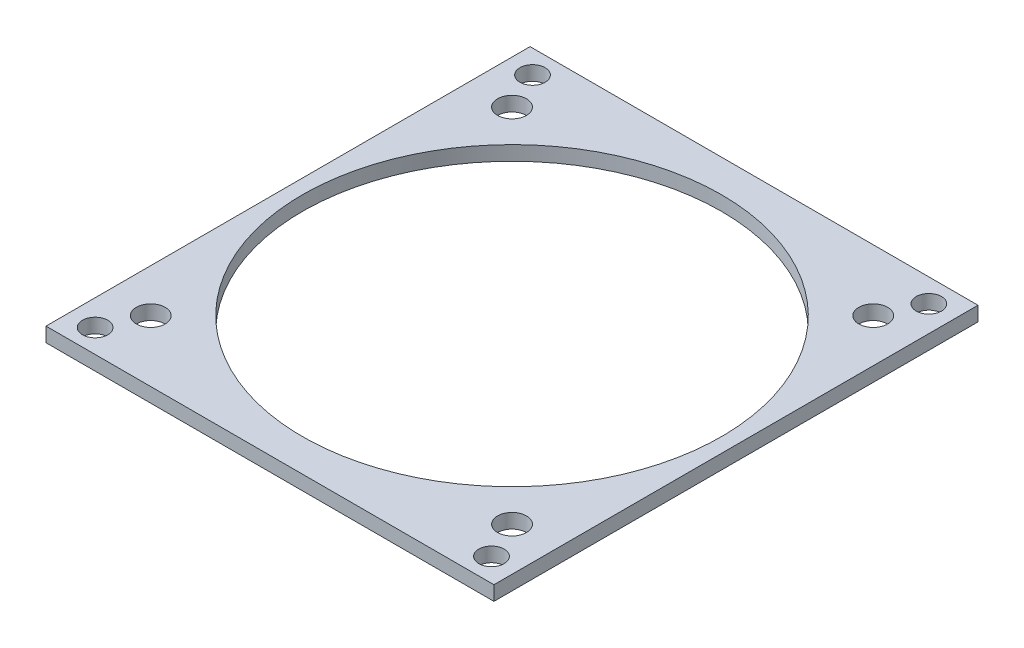
ISO-10303-21;
HEADER;
FILE_DESCRIPTION(('STEP AP214'),'2;1');
FILE_NAME('part.step','',(''),(''),'','','');
FILE_SCHEMA(('AUTOMOTIVE_DESIGN { 1 0 10303 214 1 1 1 1 }'));
ENDSEC;
DATA;
#1=APPLICATION_CONTEXT('core data for automotive mechanical design processes');
#2=APPLICATION_PROTOCOL_DEFINITION('international standard','automotive_design',2000,#1);
#3=PRODUCT_CONTEXT('',#1,'mechanical');
#4=PRODUCT('Part','Part','',(#3));
#5=PRODUCT_RELATED_PRODUCT_CATEGORY('part','',(#4));
#6=PRODUCT_DEFINITION_FORMATION('','',#4);
#7=PRODUCT_DEFINITION_CONTEXT('part definition',#1,'design');
#8=PRODUCT_DEFINITION('design','',#6,#7);
#9=PRODUCT_DEFINITION_SHAPE('','',#8);
#10=(LENGTH_UNIT() NAMED_UNIT(*) SI_UNIT(.MILLI.,.METRE.));
#11=(NAMED_UNIT(*) PLANE_ANGLE_UNIT() SI_UNIT($,.RADIAN.));
#12=(NAMED_UNIT(*) SI_UNIT($,.STERADIAN.) SOLID_ANGLE_UNIT());
#13=UNCERTAINTY_MEASURE_WITH_UNIT(LENGTH_MEASURE(1.E-05),#10,'distance_accuracy_value','');
#14=(GEOMETRIC_REPRESENTATION_CONTEXT(3) GLOBAL_UNCERTAINTY_ASSIGNED_CONTEXT((#13)) GLOBAL_UNIT_ASSIGNED_CONTEXT((#10,
#11,#12)) REPRESENTATION_CONTEXT('',''));
#15=CARTESIAN_POINT('',(0.,0.,0.));
#16=DIRECTION('',(0.,0.,1.));
#17=DIRECTION('',(1.,0.,0.));
#18=AXIS2_PLACEMENT_3D('',#15,#16,#17);
#19=CARTESIAN_POINT('',(31.,2.,0.));
#20=DIRECTION('',(1.,0.,0.));
#21=DIRECTION('',(0.,0.,-1.));
#22=AXIS2_PLACEMENT_3D('',#19,#20,#21);
#23=PLANE('',#22);
#24=DIRECTION('',(0.,0.,1.));
#25=VECTOR('',#24,1.);
#26=CARTESIAN_POINT('',(31.,0.,0.));
#27=LINE('',#26,#25);
#28=CARTESIAN_POINT('',(31.,0.,-33.5));
#29=VERTEX_POINT('',#28);
#30=CARTESIAN_POINT('',(31.,0.,33.5));
#31=VERTEX_POINT('',#30);
#32=EDGE_CURVE('E129',#29,#31,#27,.T.);
#33=ORIENTED_EDGE('',*,*,#32,.F.);
#34=DIRECTION('',(0.,-1.,0.));
#35=VECTOR('',#34,1.);
#36=CARTESIAN_POINT('',(31.,2.,-33.5));
#37=LINE('',#36,#35);
#38=CARTESIAN_POINT('',(31.,2.,-33.5));
#39=VERTEX_POINT('',#38);
#40=EDGE_CURVE('E11',#39,#29,#37,.T.);
#41=ORIENTED_EDGE('',*,*,#40,.F.);
#42=DIRECTION('',(0.,0.,1.));
#43=VECTOR('',#42,1.);
#44=CARTESIAN_POINT('',(31.,2.,0.));
#45=LINE('',#44,#43);
#46=CARTESIAN_POINT('',(31.,2.,33.5));
#47=VERTEX_POINT('',#46);
#48=EDGE_CURVE('E102',#39,#47,#45,.T.);
#49=ORIENTED_EDGE('',*,*,#48,.T.);
#50=DIRECTION('',(0.,-1.,0.));
#51=VECTOR('',#50,1.);
#52=CARTESIAN_POINT('',(31.,2.,33.5));
#53=LINE('',#52,#51);
#54=EDGE_CURVE('E79',#47,#31,#53,.T.);
#55=ORIENTED_EDGE('',*,*,#54,.T.);
#56=EDGE_LOOP('',(#33,#41,#49,#55));
#57=FACE_BOUND('',#56,.T.);
#58=ADVANCED_FACE('F38',(#57),#23,.T.);
#59=CARTESIAN_POINT('',(0.,2.,-33.5));
#60=DIRECTION('',(0.,0.,-1.));
#61=DIRECTION('',(-1.,0.,0.));
#62=AXIS2_PLACEMENT_3D('',#59,#60,#61);
#63=PLANE('',#62);
#64=DIRECTION('',(1.,0.,0.));
#65=VECTOR('',#64,1.);
#66=CARTESIAN_POINT('',(0.,0.,-33.5));
#67=LINE('',#66,#65);
#68=CARTESIAN_POINT('',(-31.,0.,-33.5));
#69=VERTEX_POINT('',#68);
#70=EDGE_CURVE('E91',#69,#29,#67,.T.);
#71=ORIENTED_EDGE('',*,*,#70,.F.);
#72=DIRECTION('',(0.,-1.,0.));
#73=VECTOR('',#72,1.);
#74=CARTESIAN_POINT('',(-31.,2.,-33.5));
#75=LINE('',#74,#73);
#76=CARTESIAN_POINT('',(-31.,2.,-33.5));
#77=VERTEX_POINT('',#76);
#78=EDGE_CURVE('E48',#77,#69,#75,.T.);
#79=ORIENTED_EDGE('',*,*,#78,.F.);
#80=DIRECTION('',(1.,0.,0.));
#81=VECTOR('',#80,1.);
#82=CARTESIAN_POINT('',(0.,2.,-33.5));
#83=LINE('',#82,#81);
#84=EDGE_CURVE('E89',#77,#39,#83,.T.);
#85=ORIENTED_EDGE('',*,*,#84,.T.);
#86=ORIENTED_EDGE('',*,*,#40,.T.);
#87=EDGE_LOOP('',(#71,#79,#85,#86));
#88=FACE_BOUND('',#87,.T.);
#89=ADVANCED_FACE('F87',(#88),#63,.T.);
#90=CARTESIAN_POINT('',(-31.,2.,0.));
#91=DIRECTION('',(1.,0.,0.));
#92=DIRECTION('',(0.,0.,-1.));
#93=AXIS2_PLACEMENT_3D('',#90,#91,#92);
#94=PLANE('',#93);
#95=DIRECTION('',(0.,0.,1.));
#96=VECTOR('',#95,1.);
#97=CARTESIAN_POINT('',(-31.,0.,0.));
#98=LINE('',#97,#96);
#99=CARTESIAN_POINT('',(-31.,0.,33.5));
#100=VERTEX_POINT('',#99);
#101=EDGE_CURVE('E134',#69,#100,#98,.T.);
#102=ORIENTED_EDGE('',*,*,#101,.T.);
#103=DIRECTION('',(0.,-1.,0.));
#104=VECTOR('',#103,1.);
#105=CARTESIAN_POINT('',(-31.,2.,33.5));
#106=LINE('',#105,#104);
#107=CARTESIAN_POINT('',(-31.,2.,33.5));
#108=VERTEX_POINT('',#107);
#109=EDGE_CURVE('E95',#108,#100,#106,.T.);
#110=ORIENTED_EDGE('',*,*,#109,.F.);
#111=DIRECTION('',(0.,0.,1.));
#112=VECTOR('',#111,1.);
#113=CARTESIAN_POINT('',(-31.,2.,0.));
#114=LINE('',#113,#112);
#115=EDGE_CURVE('E97',#77,#108,#114,.T.);
#116=ORIENTED_EDGE('',*,*,#115,.F.);
#117=ORIENTED_EDGE('',*,*,#78,.T.);
#118=EDGE_LOOP('',(#102,#110,#116,#117));
#119=FACE_BOUND('',#118,.T.);
#120=ADVANCED_FACE('F98',(#119),#94,.F.);
#121=CARTESIAN_POINT('',(25.,2.,25.));
#122=DIRECTION('',(0.,-1.,0.));
#123=DIRECTION('',(0.,0.,-1.));
#124=AXIS2_PLACEMENT_3D('',#121,#122,#123);
#125=CYLINDRICAL_SURFACE('',#124,2.00000000000001);
#126=CARTESIAN_POINT('',(25.,2.,25.));
#127=DIRECTION('',(0.,1.,0.));
#128=DIRECTION('',(0.,0.,1.));
#129=AXIS2_PLACEMENT_3D('',#126,#127,#128);
#130=CIRCLE('',#129,2.00000000000001);
#131=CARTESIAN_POINT('',(25.,2.,27.));
#132=VERTEX_POINT('',#131);
#133=EDGE_CURVE('E106',#132,#132,#130,.F.);
#134=ORIENTED_EDGE('',*,*,#133,.F.);
#135=EDGE_LOOP('',(#134));
#136=FACE_BOUND('',#135,.T.);
#137=CARTESIAN_POINT('',(25.,0.,25.));
#138=DIRECTION('',(0.,1.,0.));
#139=DIRECTION('',(0.,0.,1.));
#140=AXIS2_PLACEMENT_3D('',#137,#138,#139);
#141=CIRCLE('',#140,2.00000000000001);
#142=CARTESIAN_POINT('',(25.,0.,27.));
#143=VERTEX_POINT('',#142);
#144=EDGE_CURVE('E125',#143,#143,#141,.F.);
#145=ORIENTED_EDGE('',*,*,#144,.T.);
#146=EDGE_LOOP('',(#145));
#147=FACE_BOUND('',#146,.T.);
#148=ADVANCED_FACE('F154',(#136,#147),#125,.F.);
#149=CARTESIAN_POINT('',(-25.,2.,25.));
#150=DIRECTION('',(0.,-1.,0.));
#151=DIRECTION('',(0.,0.,-1.));
#152=AXIS2_PLACEMENT_3D('',#149,#150,#151);
#153=CYLINDRICAL_SURFACE('',#152,1.99999999999999);
#154=CARTESIAN_POINT('',(-25.,2.,25.));
#155=DIRECTION('',(0.,1.,0.));
#156=DIRECTION('',(0.,0.,1.));
#157=AXIS2_PLACEMENT_3D('',#154,#155,#156);
#158=CIRCLE('',#157,1.99999999999999);
#159=CARTESIAN_POINT('',(-25.,2.,27.));
#160=VERTEX_POINT('',#159);
#161=EDGE_CURVE('E325',#160,#160,#158,.T.);
#162=ORIENTED_EDGE('',*,*,#161,.T.);
#163=EDGE_LOOP('',(#162));
#164=FACE_BOUND('',#163,.T.);
#165=CARTESIAN_POINT('',(-25.,0.,25.));
#166=DIRECTION('',(0.,1.,0.));
#167=DIRECTION('',(0.,0.,1.));
#168=AXIS2_PLACEMENT_3D('',#165,#166,#167);
#169=CIRCLE('',#168,1.99999999999999);
#170=CARTESIAN_POINT('',(-25.,0.,27.));
#171=VERTEX_POINT('',#170);
#172=EDGE_CURVE('E121',#171,#171,#169,.T.);
#173=ORIENTED_EDGE('',*,*,#172,.F.);
#174=EDGE_LOOP('',(#173));
#175=FACE_BOUND('',#174,.T.);
#176=ADVANCED_FACE('F157',(#164,#175),#153,.F.);
#177=CARTESIAN_POINT('',(25.,2.,-25.));
#178=DIRECTION('',(0.,-1.,0.));
#179=DIRECTION('',(0.,0.,-1.));
#180=AXIS2_PLACEMENT_3D('',#177,#178,#179);
#181=CYLINDRICAL_SURFACE('',#180,2.);
#182=CARTESIAN_POINT('',(25.,2.,-25.));
#183=DIRECTION('',(0.,1.,0.));
#184=DIRECTION('',(0.,0.,1.));
#185=AXIS2_PLACEMENT_3D('',#182,#183,#184);
#186=CIRCLE('',#185,2.);
#187=CARTESIAN_POINT('',(25.,2.,-23.));
#188=VERTEX_POINT('',#187);
#189=EDGE_CURVE('E171',#188,#188,#186,.T.);
#190=ORIENTED_EDGE('',*,*,#189,.T.);
#191=EDGE_LOOP('',(#190));
#192=FACE_BOUND('',#191,.T.);
#193=CARTESIAN_POINT('',(25.,0.,-25.));
#194=DIRECTION('',(0.,1.,0.));
#195=DIRECTION('',(0.,0.,1.));
#196=AXIS2_PLACEMENT_3D('',#193,#194,#195);
#197=CIRCLE('',#196,2.);
#198=CARTESIAN_POINT('',(25.,0.,-23.));
#199=VERTEX_POINT('',#198);
#200=EDGE_CURVE('E116',#199,#199,#197,.T.);
#201=ORIENTED_EDGE('',*,*,#200,.F.);
#202=EDGE_LOOP('',(#201));
#203=FACE_BOUND('',#202,.T.);
#204=ADVANCED_FACE('F160',(#192,#203),#181,.F.);
#205=CARTESIAN_POINT('',(-25.,2.,-25.));
#206=DIRECTION('',(0.,-1.,0.));
#207=DIRECTION('',(0.,0.,-1.));
#208=AXIS2_PLACEMENT_3D('',#205,#206,#207);
#209=CYLINDRICAL_SURFACE('',#208,1.99999999999999);
#210=CARTESIAN_POINT('',(-25.,2.,-25.));
#211=DIRECTION('',(0.,1.,0.));
#212=DIRECTION('',(0.,0.,1.));
#213=AXIS2_PLACEMENT_3D('',#210,#211,#212);
#214=CIRCLE('',#213,1.99999999999999);
#215=CARTESIAN_POINT('',(-25.,2.,-23.));
#216=VERTEX_POINT('',#215);
#217=EDGE_CURVE('E139',#216,#216,#214,.F.);
#218=ORIENTED_EDGE('',*,*,#217,.F.);
#219=EDGE_LOOP('',(#218));
#220=FACE_BOUND('',#219,.T.);
#221=CARTESIAN_POINT('',(-25.,0.,-25.));
#222=DIRECTION('',(0.,1.,0.));
#223=DIRECTION('',(0.,0.,1.));
#224=AXIS2_PLACEMENT_3D('',#221,#222,#223);
#225=CIRCLE('',#224,1.99999999999999);
#226=CARTESIAN_POINT('',(-25.,0.,-23.));
#227=VERTEX_POINT('',#226);
#228=EDGE_CURVE('E112',#227,#227,#225,.F.);
#229=ORIENTED_EDGE('',*,*,#228,.T.);
#230=EDGE_LOOP('',(#229));
#231=FACE_BOUND('',#230,.T.);
#232=ADVANCED_FACE('F40',(#220,#231),#209,.F.);
#233=CARTESIAN_POINT('',(0.,2.,33.5));
#234=DIRECTION('',(0.,0.,-1.));
#235=DIRECTION('',(-1.,0.,0.));
#236=AXIS2_PLACEMENT_3D('',#233,#234,#235);
#237=PLANE('',#236);
#238=DIRECTION('',(1.,0.,0.));
#239=VECTOR('',#238,1.);
#240=CARTESIAN_POINT('',(0.,0.,33.5));
#241=LINE('',#240,#239);
#242=EDGE_CURVE('E72',#100,#31,#241,.T.);
#243=ORIENTED_EDGE('',*,*,#242,.T.);
#244=ORIENTED_EDGE('',*,*,#54,.F.);
#245=DIRECTION('',(1.,0.,0.));
#246=VECTOR('',#245,1.);
#247=CARTESIAN_POINT('',(0.,2.,33.5));
#248=LINE('',#247,#246);
#249=EDGE_CURVE('E56',#108,#47,#248,.T.);
#250=ORIENTED_EDGE('',*,*,#249,.F.);
#251=ORIENTED_EDGE('',*,*,#109,.T.);
#252=EDGE_LOOP('',(#243,#244,#250,#251));
#253=FACE_BOUND('',#252,.T.);
#254=ADVANCED_FACE('F144',(#253),#237,.F.);
#255=CARTESIAN_POINT('',(0.,2.,0.));
#256=DIRECTION('',(0.,1.,0.));
#257=DIRECTION('',(0.,0.,1.));
#258=AXIS2_PLACEMENT_3D('',#255,#256,#257);
#259=PLANE('',#258);
#260=CARTESIAN_POINT('',(27.43,2.,30.27));
#261=DIRECTION('',(0.,-1.,0.));
#262=DIRECTION('',(0.,0.,1.));
#263=AXIS2_PLACEMENT_3D('',#260,#261,#262);
#264=CIRCLE('',#263,1.75);
#265=CARTESIAN_POINT('',(27.43,2.,32.02));
#266=VERTEX_POINT('',#265);
#267=EDGE_CURVE('E294',#266,#266,#264,.T.);
#268=ORIENTED_EDGE('',*,*,#267,.T.);
#269=EDGE_LOOP('',(#268));
#270=FACE_BOUND('',#269,.T.);
#271=CARTESIAN_POINT('',(27.43,2.,-30.27));
#272=DIRECTION('',(0.,-1.,0.));
#273=DIRECTION('',(0.,0.,-1.));
#274=AXIS2_PLACEMENT_3D('',#271,#272,#273);
#275=CIRCLE('',#274,1.75);
#276=CARTESIAN_POINT('',(27.43,2.,-32.02));
#277=VERTEX_POINT('',#276);
#278=EDGE_CURVE('E339',#277,#277,#275,.T.);
#279=ORIENTED_EDGE('',*,*,#278,.T.);
#280=EDGE_LOOP('',(#279));
#281=FACE_BOUND('',#280,.T.);
#282=CARTESIAN_POINT('',(-27.43,2.,-30.27));
#283=DIRECTION('',(0.,-1.,0.));
#284=DIRECTION('',(0.,0.,1.));
#285=AXIS2_PLACEMENT_3D('',#282,#283,#284);
#286=CIRCLE('',#285,1.75);
#287=CARTESIAN_POINT('',(-27.43,2.,-28.52));
#288=VERTEX_POINT('',#287);
#289=EDGE_CURVE('E313',#288,#288,#286,.T.);
#290=ORIENTED_EDGE('',*,*,#289,.T.);
#291=EDGE_LOOP('',(#290));
#292=FACE_BOUND('',#291,.T.);
#293=CARTESIAN_POINT('',(-27.43,2.,30.27));
#294=DIRECTION('',(0.,-1.,0.));
#295=DIRECTION('',(0.,0.,-1.));
#296=AXIS2_PLACEMENT_3D('',#293,#294,#295);
#297=CIRCLE('',#296,1.75);
#298=CARTESIAN_POINT('',(-27.43,2.,28.52));
#299=VERTEX_POINT('',#298);
#300=EDGE_CURVE('E304',#299,#299,#297,.T.);
#301=ORIENTED_EDGE('',*,*,#300,.T.);
#302=EDGE_LOOP('',(#301));
#303=FACE_BOUND('',#302,.T.);
#304=CARTESIAN_POINT('',(0.,2.,0.));
#305=DIRECTION('',(0.,-1.,0.));
#306=DIRECTION('',(0.,0.,-1.));
#307=AXIS2_PLACEMENT_3D('',#304,#305,#306);
#308=CIRCLE('',#307,29.);
#309=CARTESIAN_POINT('',(0.,2.,-29.));
#310=VERTEX_POINT('',#309);
#311=EDGE_CURVE('E117',#310,#310,#308,.T.);
#312=ORIENTED_EDGE('',*,*,#311,.T.);
#313=EDGE_LOOP('',(#312));
#314=FACE_BOUND('',#313,.T.);
#315=ORIENTED_EDGE('',*,*,#217,.T.);
#316=EDGE_LOOP('',(#315));
#317=FACE_BOUND('',#316,.T.);
#318=ORIENTED_EDGE('',*,*,#189,.F.);
#319=EDGE_LOOP('',(#318));
#320=FACE_BOUND('',#319,.T.);
#321=ORIENTED_EDGE('',*,*,#161,.F.);
#322=EDGE_LOOP('',(#321));
#323=FACE_BOUND('',#322,.T.);
#324=ORIENTED_EDGE('',*,*,#133,.T.);
#325=EDGE_LOOP('',(#324));
#326=FACE_BOUND('',#325,.T.);
#327=ORIENTED_EDGE('',*,*,#48,.F.);
#328=ORIENTED_EDGE('',*,*,#84,.F.);
#329=ORIENTED_EDGE('',*,*,#115,.T.);
#330=ORIENTED_EDGE('',*,*,#249,.T.);
#331=EDGE_LOOP('',(#327,#328,#329,#330));
#332=FACE_BOUND('',#331,.T.);
#333=ADVANCED_FACE('F101',(#270,#281,#292,#303,#314,#317,#320,#323,#326,#332),#259,.T.);
#334=CARTESIAN_POINT('',(0.,0.,0.));
#335=DIRECTION('',(0.,1.,0.));
#336=DIRECTION('',(0.,0.,1.));
#337=AXIS2_PLACEMENT_3D('',#334,#335,#336);
#338=PLANE('',#337);
#339=CARTESIAN_POINT('',(27.43,0.,30.27));
#340=DIRECTION('',(0.,-1.,0.));
#341=DIRECTION('',(0.,0.,1.));
#342=AXIS2_PLACEMENT_3D('',#339,#340,#341);
#343=CIRCLE('',#342,1.75);
#344=CARTESIAN_POINT('',(27.43,0.,32.02));
#345=VERTEX_POINT('',#344);
#346=EDGE_CURVE('E296',#345,#345,#343,.T.);
#347=ORIENTED_EDGE('',*,*,#346,.F.);
#348=EDGE_LOOP('',(#347));
#349=FACE_BOUND('',#348,.T.);
#350=CARTESIAN_POINT('',(27.43,0.,-30.27));
#351=DIRECTION('',(0.,-1.,0.));
#352=DIRECTION('',(0.,0.,-1.));
#353=AXIS2_PLACEMENT_3D('',#350,#351,#352);
#354=CIRCLE('',#353,1.75);
#355=CARTESIAN_POINT('',(27.43,0.,-32.02));
#356=VERTEX_POINT('',#355);
#357=EDGE_CURVE('E300',#356,#356,#354,.T.);
#358=ORIENTED_EDGE('',*,*,#357,.F.);
#359=EDGE_LOOP('',(#358));
#360=FACE_BOUND('',#359,.T.);
#361=CARTESIAN_POINT('',(-27.43,0.,-30.27));
#362=DIRECTION('',(0.,-1.,0.));
#363=DIRECTION('',(0.,0.,1.));
#364=AXIS2_PLACEMENT_3D('',#361,#362,#363);
#365=CIRCLE('',#364,1.75);
#366=CARTESIAN_POINT('',(-27.43,0.,-28.52));
#367=VERTEX_POINT('',#366);
#368=EDGE_CURVE('E335',#367,#367,#365,.T.);
#369=ORIENTED_EDGE('',*,*,#368,.F.);
#370=EDGE_LOOP('',(#369));
#371=FACE_BOUND('',#370,.T.);
#372=CARTESIAN_POINT('',(-27.43,0.,30.27));
#373=DIRECTION('',(0.,-1.,0.));
#374=DIRECTION('',(0.,0.,-1.));
#375=AXIS2_PLACEMENT_3D('',#372,#373,#374);
#376=CIRCLE('',#375,1.75);
#377=CARTESIAN_POINT('',(-27.43,0.,28.52));
#378=VERTEX_POINT('',#377);
#379=EDGE_CURVE('E309',#378,#378,#376,.T.);
#380=ORIENTED_EDGE('',*,*,#379,.F.);
#381=EDGE_LOOP('',(#380));
#382=FACE_BOUND('',#381,.T.);
#383=CARTESIAN_POINT('',(0.,0.,0.));
#384=DIRECTION('',(0.,-1.,0.));
#385=DIRECTION('',(0.,0.,-1.));
#386=AXIS2_PLACEMENT_3D('',#383,#384,#385);
#387=CIRCLE('',#386,29.);
#388=CARTESIAN_POINT('',(0.,0.,-29.));
#389=VERTEX_POINT('',#388);
#390=EDGE_CURVE('E308',#389,#389,#387,.T.);
#391=ORIENTED_EDGE('',*,*,#390,.F.);
#392=EDGE_LOOP('',(#391));
#393=FACE_BOUND('',#392,.T.);
#394=ORIENTED_EDGE('',*,*,#228,.F.);
#395=EDGE_LOOP('',(#394));
#396=FACE_BOUND('',#395,.T.);
#397=ORIENTED_EDGE('',*,*,#200,.T.);
#398=EDGE_LOOP('',(#397));
#399=FACE_BOUND('',#398,.T.);
#400=ORIENTED_EDGE('',*,*,#172,.T.);
#401=EDGE_LOOP('',(#400));
#402=FACE_BOUND('',#401,.T.);
#403=ORIENTED_EDGE('',*,*,#144,.F.);
#404=EDGE_LOOP('',(#403));
#405=FACE_BOUND('',#404,.T.);
#406=ORIENTED_EDGE('',*,*,#32,.T.);
#407=ORIENTED_EDGE('',*,*,#242,.F.);
#408=ORIENTED_EDGE('',*,*,#101,.F.);
#409=ORIENTED_EDGE('',*,*,#70,.T.);
#410=EDGE_LOOP('',(#406,#407,#408,#409));
#411=FACE_BOUND('',#410,.T.);
#412=ADVANCED_FACE('F145',(#349,#360,#371,#382,#393,#396,#399,#402,#405,#411),#338,.F.);
#413=CARTESIAN_POINT('',(0.,2.,0.));
#414=DIRECTION('',(0.,-1.,0.));
#415=DIRECTION('',(0.,0.,-1.));
#416=AXIS2_PLACEMENT_3D('',#413,#414,#415);
#417=CYLINDRICAL_SURFACE('',#416,29.);
#418=ORIENTED_EDGE('',*,*,#311,.F.);
#419=EDGE_LOOP('',(#418));
#420=FACE_BOUND('',#419,.T.);
#421=ORIENTED_EDGE('',*,*,#390,.T.);
#422=EDGE_LOOP('',(#421));
#423=FACE_BOUND('',#422,.T.);
#424=ADVANCED_FACE('F176',(#420,#423),#417,.F.);
#425=CARTESIAN_POINT('',(-27.43,2.,30.27));
#426=DIRECTION('',(0.,-1.,0.));
#427=DIRECTION('',(0.,0.,-1.));
#428=AXIS2_PLACEMENT_3D('',#425,#426,#427);
#429=CYLINDRICAL_SURFACE('',#428,1.75);
#430=ORIENTED_EDGE('',*,*,#300,.F.);
#431=EDGE_LOOP('',(#430));
#432=FACE_BOUND('',#431,.T.);
#433=ORIENTED_EDGE('',*,*,#379,.T.);
#434=EDGE_LOOP('',(#433));
#435=FACE_BOUND('',#434,.T.);
#436=ADVANCED_FACE('F189',(#432,#435),#429,.F.);
#437=CARTESIAN_POINT('',(-27.43,2.,-30.27));
#438=DIRECTION('',(0.,-1.,0.));
#439=DIRECTION('',(0.,0.,-1.));
#440=AXIS2_PLACEMENT_3D('',#437,#438,#439);
#441=CYLINDRICAL_SURFACE('',#440,1.75);
#442=ORIENTED_EDGE('',*,*,#289,.F.);
#443=EDGE_LOOP('',(#442));
#444=FACE_BOUND('',#443,.T.);
#445=ORIENTED_EDGE('',*,*,#368,.T.);
#446=EDGE_LOOP('',(#445));
#447=FACE_BOUND('',#446,.T.);
#448=ADVANCED_FACE('F257',(#444,#447),#441,.F.);
#449=CARTESIAN_POINT('',(27.43,2.,-30.27));
#450=DIRECTION('',(0.,-1.,0.));
#451=DIRECTION('',(0.,0.,-1.));
#452=AXIS2_PLACEMENT_3D('',#449,#450,#451);
#453=CYLINDRICAL_SURFACE('',#452,1.75);
#454=ORIENTED_EDGE('',*,*,#278,.F.);
#455=EDGE_LOOP('',(#454));
#456=FACE_BOUND('',#455,.T.);
#457=ORIENTED_EDGE('',*,*,#357,.T.);
#458=EDGE_LOOP('',(#457));
#459=FACE_BOUND('',#458,.T.);
#460=ADVANCED_FACE('F264',(#456,#459),#453,.F.);
#461=CARTESIAN_POINT('',(27.43,2.,30.27));
#462=DIRECTION('',(0.,-1.,0.));
#463=DIRECTION('',(0.,0.,-1.));
#464=AXIS2_PLACEMENT_3D('',#461,#462,#463);
#465=CYLINDRICAL_SURFACE('',#464,1.75);
#466=ORIENTED_EDGE('',*,*,#267,.F.);
#467=EDGE_LOOP('',(#466));
#468=FACE_BOUND('',#467,.T.);
#469=ORIENTED_EDGE('',*,*,#346,.T.);
#470=EDGE_LOOP('',(#469));
#471=FACE_BOUND('',#470,.T.);
#472=ADVANCED_FACE('F272',(#468,#471),#465,.F.);
#473=CLOSED_SHELL('',(#58,#89,#120,#148,#176,#204,#232,#254,#333,#412,#424,#436,#448,#460,#472));
#474=MANIFOLD_SOLID_BREP('B2',#473);
#475=ADVANCED_BREP_SHAPE_REPRESENTATION('',(#18,#474),#14);
#476=SHAPE_DEFINITION_REPRESENTATION(#9,#475);
ENDSEC;
END-ISO-10303-21;
